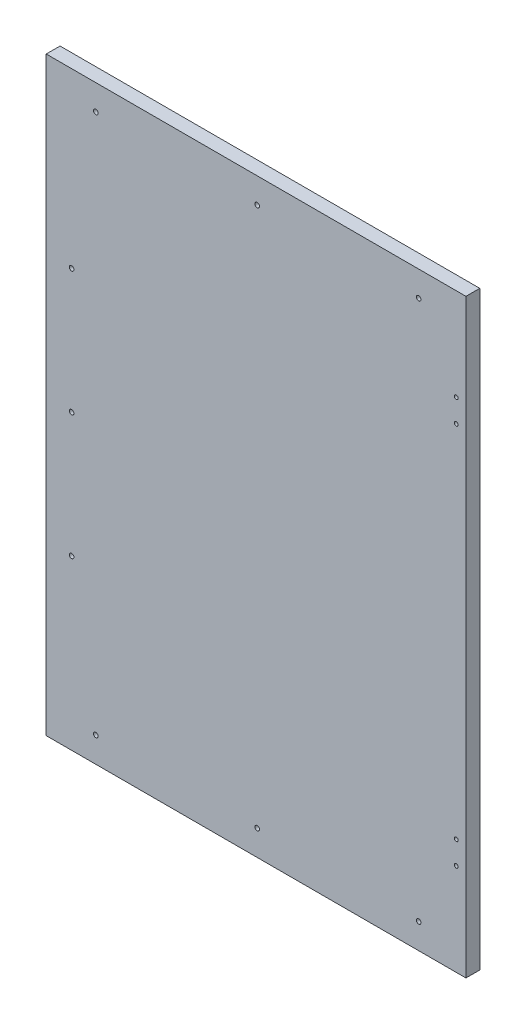
ISO-10303-21;
HEADER;
FILE_DESCRIPTION(('STEP AP214'),'2;1');
FILE_NAME('part.step','',(''),(''),'','','');
FILE_SCHEMA(('AUTOMOTIVE_DESIGN { 1 0 10303 214 1 1 1 1 }'));
ENDSEC;
DATA;
#1=APPLICATION_CONTEXT('core data for automotive mechanical design processes');
#2=APPLICATION_PROTOCOL_DEFINITION('international standard','automotive_design',2000,#1);
#3=PRODUCT_CONTEXT('',#1,'mechanical');
#4=PRODUCT('Part','Part','',(#3));
#5=PRODUCT_RELATED_PRODUCT_CATEGORY('part','',(#4));
#6=PRODUCT_DEFINITION_FORMATION('','',#4);
#7=PRODUCT_DEFINITION_CONTEXT('part definition',#1,'design');
#8=PRODUCT_DEFINITION('design','',#6,#7);
#9=PRODUCT_DEFINITION_SHAPE('','',#8);
#10=(LENGTH_UNIT() NAMED_UNIT(*) SI_UNIT(.MILLI.,.METRE.));
#11=(NAMED_UNIT(*) PLANE_ANGLE_UNIT() SI_UNIT($,.RADIAN.));
#12=(NAMED_UNIT(*) SI_UNIT($,.STERADIAN.) SOLID_ANGLE_UNIT());
#13=UNCERTAINTY_MEASURE_WITH_UNIT(LENGTH_MEASURE(1.E-05),#10,'distance_accuracy_value','');
#14=(GEOMETRIC_REPRESENTATION_CONTEXT(3) GLOBAL_UNCERTAINTY_ASSIGNED_CONTEXT((#13)) GLOBAL_UNIT_ASSIGNED_CONTEXT((#10,
#11,#12)) REPRESENTATION_CONTEXT('',''));
#15=CARTESIAN_POINT('',(0.,0.,0.));
#16=DIRECTION('',(0.,0.,1.));
#17=DIRECTION('',(1.,0.,0.));
#18=AXIS2_PLACEMENT_3D('',#15,#16,#17);
#19=CARTESIAN_POINT('',(227.5,320.,15.));
#20=DIRECTION('',(-1.,0.,0.));
#21=DIRECTION('',(0.,-1.,0.));
#22=AXIS2_PLACEMENT_3D('',#19,#20,#21);
#23=PLANE('',#22);
#24=DIRECTION('',(0.,1.,0.));
#25=VECTOR('',#24,1.);
#26=CARTESIAN_POINT('',(227.5,320.,0.));
#27=LINE('',#26,#25);
#28=CARTESIAN_POINT('',(227.5,-320.,0.));
#29=VERTEX_POINT('',#28);
#30=CARTESIAN_POINT('',(227.5,320.,0.));
#31=VERTEX_POINT('',#30);
#32=EDGE_CURVE('E100',#29,#31,#27,.T.);
#33=ORIENTED_EDGE('',*,*,#32,.T.);
#34=DIRECTION('',(0.,0.,-1.));
#35=VECTOR('',#34,1.);
#36=CARTESIAN_POINT('',(227.5,320.,15.));
#37=LINE('',#36,#35);
#38=CARTESIAN_POINT('',(227.5,320.,15.));
#39=VERTEX_POINT('',#38);
#40=EDGE_CURVE('E11',#39,#31,#37,.T.);
#41=ORIENTED_EDGE('',*,*,#40,.F.);
#42=DIRECTION('',(0.,1.,0.));
#43=VECTOR('',#42,1.);
#44=CARTESIAN_POINT('',(227.5,320.,15.));
#45=LINE('',#44,#43);
#46=CARTESIAN_POINT('',(227.5,-320.,15.));
#47=VERTEX_POINT('',#46);
#48=EDGE_CURVE('E88',#47,#39,#45,.T.);
#49=ORIENTED_EDGE('',*,*,#48,.F.);
#50=DIRECTION('',(0.,0.,-1.));
#51=VECTOR('',#50,1.);
#52=CARTESIAN_POINT('',(227.5,-320.,15.));
#53=LINE('',#52,#51);
#54=EDGE_CURVE('E96',#47,#29,#53,.T.);
#55=ORIENTED_EDGE('',*,*,#54,.T.);
#56=EDGE_LOOP('',(#33,#41,#49,#55));
#57=FACE_BOUND('',#56,.T.);
#58=ADVANCED_FACE('F37',(#57),#23,.F.);
#59=CARTESIAN_POINT('',(-227.5,320.,15.));
#60=DIRECTION('',(0.,-1.,0.));
#61=DIRECTION('',(0.,0.,-1.));
#62=AXIS2_PLACEMENT_3D('',#59,#60,#61);
#63=PLANE('',#62);
#64=DIRECTION('',(-1.,0.,0.));
#65=VECTOR('',#64,1.);
#66=CARTESIAN_POINT('',(-227.5,320.,0.));
#67=LINE('',#66,#65);
#68=CARTESIAN_POINT('',(-227.5,320.,0.));
#69=VERTEX_POINT('',#68);
#70=EDGE_CURVE('E92',#31,#69,#67,.T.);
#71=ORIENTED_EDGE('',*,*,#70,.T.);
#72=DIRECTION('',(0.,0.,-1.));
#73=VECTOR('',#72,1.);
#74=CARTESIAN_POINT('',(-227.5,320.,15.));
#75=LINE('',#74,#73);
#76=CARTESIAN_POINT('',(-227.5,320.,15.));
#77=VERTEX_POINT('',#76);
#78=EDGE_CURVE('E45',#77,#69,#75,.T.);
#79=ORIENTED_EDGE('',*,*,#78,.F.);
#80=DIRECTION('',(-1.,0.,0.));
#81=VECTOR('',#80,1.);
#82=CARTESIAN_POINT('',(-227.5,320.,15.));
#83=LINE('',#82,#81);
#84=EDGE_CURVE('E83',#39,#77,#83,.T.);
#85=ORIENTED_EDGE('',*,*,#84,.F.);
#86=ORIENTED_EDGE('',*,*,#40,.T.);
#87=EDGE_LOOP('',(#71,#79,#85,#86));
#88=FACE_BOUND('',#87,.T.);
#89=ADVANCED_FACE('F91',(#88),#63,.F.);
#90=CARTESIAN_POINT('',(-227.5,320.,15.));
#91=DIRECTION('',(1.,0.,0.));
#92=DIRECTION('',(0.,1.,0.));
#93=AXIS2_PLACEMENT_3D('',#90,#91,#92);
#94=PLANE('',#93);
#95=DIRECTION('',(0.,-1.,0.));
#96=VECTOR('',#95,1.);
#97=CARTESIAN_POINT('',(-227.5,320.,0.));
#98=LINE('',#97,#96);
#99=CARTESIAN_POINT('',(-227.5,-320.,0.));
#100=VERTEX_POINT('',#99);
#101=EDGE_CURVE('E70',#69,#100,#98,.T.);
#102=ORIENTED_EDGE('',*,*,#101,.T.);
#103=DIRECTION('',(0.,0.,-1.));
#104=VECTOR('',#103,1.);
#105=CARTESIAN_POINT('',(-227.5,-320.,15.));
#106=LINE('',#105,#104);
#107=CARTESIAN_POINT('',(-227.5,-320.,15.));
#108=VERTEX_POINT('',#107);
#109=EDGE_CURVE('E93',#108,#100,#106,.T.);
#110=ORIENTED_EDGE('',*,*,#109,.F.);
#111=DIRECTION('',(0.,-1.,0.));
#112=VECTOR('',#111,1.);
#113=CARTESIAN_POINT('',(-227.5,320.,15.));
#114=LINE('',#113,#112);
#115=EDGE_CURVE('E86',#77,#108,#114,.T.);
#116=ORIENTED_EDGE('',*,*,#115,.F.);
#117=ORIENTED_EDGE('',*,*,#78,.T.);
#118=EDGE_LOOP('',(#102,#110,#116,#117));
#119=FACE_BOUND('',#118,.T.);
#120=ADVANCED_FACE('F94',(#119),#94,.F.);
#121=CARTESIAN_POINT('',(-227.5,-320.,15.));
#122=DIRECTION('',(0.,1.,0.));
#123=DIRECTION('',(0.,0.,1.));
#124=AXIS2_PLACEMENT_3D('',#121,#122,#123);
#125=PLANE('',#124);
#126=DIRECTION('',(1.,0.,0.));
#127=VECTOR('',#126,1.);
#128=CARTESIAN_POINT('',(-227.5,-320.,0.));
#129=LINE('',#128,#127);
#130=EDGE_CURVE('E76',#100,#29,#129,.T.);
#131=ORIENTED_EDGE('',*,*,#130,.T.);
#132=ORIENTED_EDGE('',*,*,#54,.F.);
#133=DIRECTION('',(1.,0.,0.));
#134=VECTOR('',#133,1.);
#135=CARTESIAN_POINT('',(-227.5,-320.,15.));
#136=LINE('',#135,#134);
#137=EDGE_CURVE('E53',#108,#47,#136,.T.);
#138=ORIENTED_EDGE('',*,*,#137,.F.);
#139=ORIENTED_EDGE('',*,*,#109,.T.);
#140=EDGE_LOOP('',(#131,#132,#138,#139));
#141=FACE_BOUND('',#140,.T.);
#142=ADVANCED_FACE('F108',(#141),#125,.F.);
#143=CARTESIAN_POINT('',(0.,0.,15.));
#144=DIRECTION('',(0.,0.,1.));
#145=DIRECTION('',(1.,0.,0.));
#146=AXIS2_PLACEMENT_3D('',#143,#144,#145);
#147=PLANE('',#146);
#148=CARTESIAN_POINT('',(217.,220.,15.));
#149=DIRECTION('',(0.,0.,-1.));
#150=DIRECTION('',(1.,0.,0.));
#151=AXIS2_PLACEMENT_3D('',#148,#149,#150);
#152=CIRCLE('',#151,2.09999999999999);
#153=CARTESIAN_POINT('',(219.1,220.,15.));
#154=VERTEX_POINT('',#153);
#155=EDGE_CURVE('E186',#154,#154,#152,.T.);
#156=ORIENTED_EDGE('',*,*,#155,.T.);
#157=EDGE_LOOP('',(#156));
#158=FACE_BOUND('',#157,.T.);
#159=CARTESIAN_POINT('',(217.,195.,15.));
#160=DIRECTION('',(0.,0.,-1.));
#161=DIRECTION('',(1.,0.,0.));
#162=AXIS2_PLACEMENT_3D('',#159,#160,#161);
#163=CIRCLE('',#162,2.09999999999999);
#164=CARTESIAN_POINT('',(219.1,195.,15.));
#165=VERTEX_POINT('',#164);
#166=EDGE_CURVE('E180',#165,#165,#163,.T.);
#167=ORIENTED_EDGE('',*,*,#166,.T.);
#168=EDGE_LOOP('',(#167));
#169=FACE_BOUND('',#168,.T.);
#170=CARTESIAN_POINT('',(217.,-220.,15.));
#171=DIRECTION('',(0.,0.,1.));
#172=DIRECTION('',(1.,0.,0.));
#173=AXIS2_PLACEMENT_3D('',#170,#171,#172);
#174=CIRCLE('',#173,2.09999999999999);
#175=CARTESIAN_POINT('',(219.1,-220.,15.));
#176=VERTEX_POINT('',#175);
#177=EDGE_CURVE('E175',#176,#176,#174,.T.);
#178=ORIENTED_EDGE('',*,*,#177,.F.);
#179=EDGE_LOOP('',(#178));
#180=FACE_BOUND('',#179,.T.);
#181=CARTESIAN_POINT('',(217.,-195.,15.));
#182=DIRECTION('',(0.,0.,1.));
#183=DIRECTION('',(1.,0.,0.));
#184=AXIS2_PLACEMENT_3D('',#181,#182,#183);
#185=CIRCLE('',#184,2.09999999999999);
#186=CARTESIAN_POINT('',(219.1,-195.,15.));
#187=VERTEX_POINT('',#186);
#188=EDGE_CURVE('E171',#187,#187,#185,.T.);
#189=ORIENTED_EDGE('',*,*,#188,.F.);
#190=EDGE_LOOP('',(#189));
#191=FACE_BOUND('',#190,.T.);
#192=CARTESIAN_POINT('',(-173.75,-292.5,15.));
#193=DIRECTION('',(0.,0.,-1.));
#194=DIRECTION('',(1.,0.,0.));
#195=AXIS2_PLACEMENT_3D('',#192,#193,#194);
#196=CIRCLE('',#195,2.50000000000002);
#197=CARTESIAN_POINT('',(-171.25,-292.5,15.));
#198=VERTEX_POINT('',#197);
#199=EDGE_CURVE('E163',#198,#198,#196,.T.);
#200=ORIENTED_EDGE('',*,*,#199,.T.);
#201=EDGE_LOOP('',(#200));
#202=FACE_BOUND('',#201,.T.);
#203=CARTESIAN_POINT('',(1.24999999999997,-292.5,15.));
#204=DIRECTION('',(0.,0.,-1.));
#205=DIRECTION('',(1.,0.,0.));
#206=AXIS2_PLACEMENT_3D('',#203,#204,#205);
#207=CIRCLE('',#206,2.5);
#208=CARTESIAN_POINT('',(3.74999999999998,-292.5,15.));
#209=VERTEX_POINT('',#208);
#210=EDGE_CURVE('E157',#209,#209,#207,.T.);
#211=ORIENTED_EDGE('',*,*,#210,.T.);
#212=EDGE_LOOP('',(#211));
#213=FACE_BOUND('',#212,.T.);
#214=CARTESIAN_POINT('',(176.25,-292.5,15.));
#215=DIRECTION('',(0.,0.,-1.));
#216=DIRECTION('',(1.,0.,0.));
#217=AXIS2_PLACEMENT_3D('',#214,#215,#216);
#218=CIRCLE('',#217,2.50000000000002);
#219=CARTESIAN_POINT('',(178.75,-292.5,15.));
#220=VERTEX_POINT('',#219);
#221=EDGE_CURVE('E150',#220,#220,#218,.T.);
#222=ORIENTED_EDGE('',*,*,#221,.T.);
#223=EDGE_LOOP('',(#222));
#224=FACE_BOUND('',#223,.T.);
#225=CARTESIAN_POINT('',(-173.75,292.5,15.));
#226=DIRECTION('',(0.,0.,1.));
#227=DIRECTION('',(1.,0.,0.));
#228=AXIS2_PLACEMENT_3D('',#225,#226,#227);
#229=CIRCLE('',#228,2.50000000000002);
#230=CARTESIAN_POINT('',(-171.25,292.5,15.));
#231=VERTEX_POINT('',#230);
#232=EDGE_CURVE('E145',#231,#231,#229,.T.);
#233=ORIENTED_EDGE('',*,*,#232,.F.);
#234=EDGE_LOOP('',(#233));
#235=FACE_BOUND('',#234,.T.);
#236=CARTESIAN_POINT('',(1.24999999999997,292.5,15.));
#237=DIRECTION('',(0.,0.,1.));
#238=DIRECTION('',(1.,0.,0.));
#239=AXIS2_PLACEMENT_3D('',#236,#237,#238);
#240=CIRCLE('',#239,2.5);
#241=CARTESIAN_POINT('',(3.74999999999998,292.5,15.));
#242=VERTEX_POINT('',#241);
#243=EDGE_CURVE('E142',#242,#242,#240,.T.);
#244=ORIENTED_EDGE('',*,*,#243,.F.);
#245=EDGE_LOOP('',(#244));
#246=FACE_BOUND('',#245,.T.);
#247=CARTESIAN_POINT('',(176.25,292.5,15.));
#248=DIRECTION('',(0.,0.,1.));
#249=DIRECTION('',(1.,0.,0.));
#250=AXIS2_PLACEMENT_3D('',#247,#248,#249);
#251=CIRCLE('',#250,2.50000000000002);
#252=CARTESIAN_POINT('',(178.75,292.5,15.));
#253=VERTEX_POINT('',#252);
#254=EDGE_CURVE('E135',#253,#253,#251,.T.);
#255=ORIENTED_EDGE('',*,*,#254,.F.);
#256=EDGE_LOOP('',(#255));
#257=FACE_BOUND('',#256,.T.);
#258=CARTESIAN_POINT('',(-200.,-137.5,15.));
#259=DIRECTION('',(0.,0.,1.));
#260=DIRECTION('',(1.,0.,0.));
#261=AXIS2_PLACEMENT_3D('',#258,#259,#260);
#262=CIRCLE('',#261,2.50000000000002);
#263=CARTESIAN_POINT('',(-197.5,-137.5,15.));
#264=VERTEX_POINT('',#263);
#265=EDGE_CURVE('E103',#264,#264,#262,.T.);
#266=ORIENTED_EDGE('',*,*,#265,.F.);
#267=EDGE_LOOP('',(#266));
#268=FACE_BOUND('',#267,.T.);
#269=CARTESIAN_POINT('',(-200.,-2.49999999999995,15.));
#270=DIRECTION('',(0.,0.,1.));
#271=DIRECTION('',(1.,0.,0.));
#272=AXIS2_PLACEMENT_3D('',#269,#270,#271);
#273=CIRCLE('',#272,2.50000000000002);
#274=CARTESIAN_POINT('',(-197.5,-2.49999999999995,15.));
#275=VERTEX_POINT('',#274);
#276=EDGE_CURVE('E116',#275,#275,#273,.T.);
#277=ORIENTED_EDGE('',*,*,#276,.F.);
#278=EDGE_LOOP('',(#277));
#279=FACE_BOUND('',#278,.T.);
#280=CARTESIAN_POINT('',(-200.,132.5,15.));
#281=DIRECTION('',(0.,0.,1.));
#282=DIRECTION('',(1.,0.,0.));
#283=AXIS2_PLACEMENT_3D('',#280,#281,#282);
#284=CIRCLE('',#283,2.50000000000002);
#285=CARTESIAN_POINT('',(-197.5,132.5,15.));
#286=VERTEX_POINT('',#285);
#287=EDGE_CURVE('E119',#286,#286,#284,.T.);
#288=ORIENTED_EDGE('',*,*,#287,.F.);
#289=EDGE_LOOP('',(#288));
#290=FACE_BOUND('',#289,.T.);
#291=ORIENTED_EDGE('',*,*,#48,.T.);
#292=ORIENTED_EDGE('',*,*,#84,.T.);
#293=ORIENTED_EDGE('',*,*,#115,.T.);
#294=ORIENTED_EDGE('',*,*,#137,.T.);
#295=EDGE_LOOP('',(#291,#292,#293,#294));
#296=FACE_BOUND('',#295,.T.);
#297=ADVANCED_FACE('F84',(#158,#169,#180,#191,#202,#213,#224,#235,#246,#257,#268,#279,#290,
#296),#147,.T.);
#298=CARTESIAN_POINT('',(0.,0.,0.));
#299=DIRECTION('',(0.,0.,1.));
#300=DIRECTION('',(1.,0.,0.));
#301=AXIS2_PLACEMENT_3D('',#298,#299,#300);
#302=PLANE('',#301);
#303=CARTESIAN_POINT('',(217.,220.,0.));
#304=DIRECTION('',(0.,0.,-1.));
#305=DIRECTION('',(1.,0.,0.));
#306=AXIS2_PLACEMENT_3D('',#303,#304,#305);
#307=CIRCLE('',#306,2.09999999999999);
#308=CARTESIAN_POINT('',(219.1,220.,0.));
#309=VERTEX_POINT('',#308);
#310=EDGE_CURVE('E172',#309,#309,#307,.T.);
#311=ORIENTED_EDGE('',*,*,#310,.F.);
#312=EDGE_LOOP('',(#311));
#313=FACE_BOUND('',#312,.T.);
#314=CARTESIAN_POINT('',(217.,195.,0.));
#315=DIRECTION('',(0.,0.,-1.));
#316=DIRECTION('',(1.,0.,0.));
#317=AXIS2_PLACEMENT_3D('',#314,#315,#316);
#318=CIRCLE('',#317,2.09999999999999);
#319=CARTESIAN_POINT('',(219.1,195.,0.));
#320=VERTEX_POINT('',#319);
#321=EDGE_CURVE('E183',#320,#320,#318,.T.);
#322=ORIENTED_EDGE('',*,*,#321,.F.);
#323=EDGE_LOOP('',(#322));
#324=FACE_BOUND('',#323,.T.);
#325=CARTESIAN_POINT('',(217.,-220.,0.));
#326=DIRECTION('',(0.,0.,1.));
#327=DIRECTION('',(1.,0.,0.));
#328=AXIS2_PLACEMENT_3D('',#325,#326,#327);
#329=CIRCLE('',#328,2.09999999999999);
#330=CARTESIAN_POINT('',(219.1,-220.,0.));
#331=VERTEX_POINT('',#330);
#332=EDGE_CURVE('E154',#331,#331,#329,.T.);
#333=ORIENTED_EDGE('',*,*,#332,.T.);
#334=EDGE_LOOP('',(#333));
#335=FACE_BOUND('',#334,.T.);
#336=CARTESIAN_POINT('',(217.,-195.,0.));
#337=DIRECTION('',(0.,0.,1.));
#338=DIRECTION('',(1.,0.,0.));
#339=AXIS2_PLACEMENT_3D('',#336,#337,#338);
#340=CIRCLE('',#339,2.09999999999999);
#341=CARTESIAN_POINT('',(219.1,-195.,0.));
#342=VERTEX_POINT('',#341);
#343=EDGE_CURVE('E168',#342,#342,#340,.T.);
#344=ORIENTED_EDGE('',*,*,#343,.T.);
#345=EDGE_LOOP('',(#344));
#346=FACE_BOUND('',#345,.T.);
#347=CARTESIAN_POINT('',(-173.75,-292.5,0.));
#348=DIRECTION('',(0.,0.,-1.));
#349=DIRECTION('',(1.,0.,0.));
#350=AXIS2_PLACEMENT_3D('',#347,#348,#349);
#351=CIRCLE('',#350,2.50000000000002);
#352=CARTESIAN_POINT('',(-171.25,-292.5,0.));
#353=VERTEX_POINT('',#352);
#354=EDGE_CURVE('E136',#353,#353,#351,.T.);
#355=ORIENTED_EDGE('',*,*,#354,.F.);
#356=EDGE_LOOP('',(#355));
#357=FACE_BOUND('',#356,.T.);
#358=CARTESIAN_POINT('',(1.24999999999997,-292.5,0.));
#359=DIRECTION('',(0.,0.,-1.));
#360=DIRECTION('',(1.,0.,0.));
#361=AXIS2_PLACEMENT_3D('',#358,#359,#360);
#362=CIRCLE('',#361,2.5);
#363=CARTESIAN_POINT('',(3.74999999999998,-292.5,0.));
#364=VERTEX_POINT('',#363);
#365=EDGE_CURVE('E160',#364,#364,#362,.T.);
#366=ORIENTED_EDGE('',*,*,#365,.F.);
#367=EDGE_LOOP('',(#366));
#368=FACE_BOUND('',#367,.T.);
#369=CARTESIAN_POINT('',(176.25,-292.5,0.));
#370=DIRECTION('',(0.,0.,-1.));
#371=DIRECTION('',(1.,0.,0.));
#372=AXIS2_PLACEMENT_3D('',#369,#370,#371);
#373=CIRCLE('',#372,2.50000000000002);
#374=CARTESIAN_POINT('',(178.75,-292.5,0.));
#375=VERTEX_POINT('',#374);
#376=EDGE_CURVE('E153',#375,#375,#373,.T.);
#377=ORIENTED_EDGE('',*,*,#376,.F.);
#378=EDGE_LOOP('',(#377));
#379=FACE_BOUND('',#378,.T.);
#380=CARTESIAN_POINT('',(-173.75,292.5,0.));
#381=DIRECTION('',(0.,0.,1.));
#382=DIRECTION('',(1.,0.,0.));
#383=AXIS2_PLACEMENT_3D('',#380,#381,#382);
#384=CIRCLE('',#383,2.50000000000002);
#385=CARTESIAN_POINT('',(-171.25,292.5,0.));
#386=VERTEX_POINT('',#385);
#387=EDGE_CURVE('E127',#386,#386,#384,.T.);
#388=ORIENTED_EDGE('',*,*,#387,.T.);
#389=EDGE_LOOP('',(#388));
#390=FACE_BOUND('',#389,.T.);
#391=CARTESIAN_POINT('',(1.24999999999997,292.5,0.));
#392=DIRECTION('',(0.,0.,1.));
#393=DIRECTION('',(1.,0.,0.));
#394=AXIS2_PLACEMENT_3D('',#391,#392,#393);
#395=CIRCLE('',#394,2.5);
#396=CARTESIAN_POINT('',(3.74999999999998,292.5,0.));
#397=VERTEX_POINT('',#396);
#398=EDGE_CURVE('E139',#397,#397,#395,.T.);
#399=ORIENTED_EDGE('',*,*,#398,.T.);
#400=EDGE_LOOP('',(#399));
#401=FACE_BOUND('',#400,.T.);
#402=CARTESIAN_POINT('',(176.25,292.5,0.));
#403=DIRECTION('',(0.,0.,1.));
#404=DIRECTION('',(1.,0.,0.));
#405=AXIS2_PLACEMENT_3D('',#402,#403,#404);
#406=CIRCLE('',#405,2.50000000000002);
#407=CARTESIAN_POINT('',(178.75,292.5,0.));
#408=VERTEX_POINT('',#407);
#409=EDGE_CURVE('E132',#408,#408,#406,.T.);
#410=ORIENTED_EDGE('',*,*,#409,.T.);
#411=EDGE_LOOP('',(#410));
#412=FACE_BOUND('',#411,.T.);
#413=CARTESIAN_POINT('',(-200.,-137.5,0.));
#414=DIRECTION('',(0.,0.,1.));
#415=DIRECTION('',(1.,0.,0.));
#416=AXIS2_PLACEMENT_3D('',#413,#414,#415);
#417=CIRCLE('',#416,2.50000000000002);
#418=CARTESIAN_POINT('',(-197.5,-137.5,0.));
#419=VERTEX_POINT('',#418);
#420=EDGE_CURVE('E122',#419,#419,#417,.T.);
#421=ORIENTED_EDGE('',*,*,#420,.T.);
#422=EDGE_LOOP('',(#421));
#423=FACE_BOUND('',#422,.T.);
#424=CARTESIAN_POINT('',(-200.,-2.49999999999995,0.));
#425=DIRECTION('',(0.,0.,1.));
#426=DIRECTION('',(1.,0.,0.));
#427=AXIS2_PLACEMENT_3D('',#424,#425,#426);
#428=CIRCLE('',#427,2.50000000000002);
#429=CARTESIAN_POINT('',(-197.5,-2.49999999999995,0.));
#430=VERTEX_POINT('',#429);
#431=EDGE_CURVE('E126',#430,#430,#428,.T.);
#432=ORIENTED_EDGE('',*,*,#431,.T.);
#433=EDGE_LOOP('',(#432));
#434=FACE_BOUND('',#433,.T.);
#435=CARTESIAN_POINT('',(-200.,132.5,0.));
#436=DIRECTION('',(0.,0.,1.));
#437=DIRECTION('',(1.,0.,0.));
#438=AXIS2_PLACEMENT_3D('',#435,#436,#437);
#439=CIRCLE('',#438,2.50000000000002);
#440=CARTESIAN_POINT('',(-197.5,132.5,0.));
#441=VERTEX_POINT('',#440);
#442=EDGE_CURVE('E123',#441,#441,#439,.T.);
#443=ORIENTED_EDGE('',*,*,#442,.T.);
#444=EDGE_LOOP('',(#443));
#445=FACE_BOUND('',#444,.T.);
#446=ORIENTED_EDGE('',*,*,#32,.F.);
#447=ORIENTED_EDGE('',*,*,#130,.F.);
#448=ORIENTED_EDGE('',*,*,#101,.F.);
#449=ORIENTED_EDGE('',*,*,#70,.F.);
#450=EDGE_LOOP('',(#446,#447,#448,#449));
#451=FACE_BOUND('',#450,.T.);
#452=ADVANCED_FACE('F111',(#313,#324,#335,#346,#357,#368,#379,#390,#401,#412,#423,#434,#445,
#451),#302,.F.);
#453=CARTESIAN_POINT('',(-200.,132.5,0.));
#454=DIRECTION('',(0.,0.,1.));
#455=DIRECTION('',(1.,0.,0.));
#456=AXIS2_PLACEMENT_3D('',#453,#454,#455);
#457=CYLINDRICAL_SURFACE('',#456,2.50000000000002);
#458=ORIENTED_EDGE('',*,*,#287,.T.);
#459=EDGE_LOOP('',(#458));
#460=FACE_BOUND('',#459,.T.);
#461=ORIENTED_EDGE('',*,*,#442,.F.);
#462=EDGE_LOOP('',(#461));
#463=FACE_BOUND('',#462,.T.);
#464=ADVANCED_FACE('F197',(#460,#463),#457,.F.);
#465=CARTESIAN_POINT('',(-200.,-2.49999999999995,0.));
#466=DIRECTION('',(0.,0.,1.));
#467=DIRECTION('',(1.,0.,0.));
#468=AXIS2_PLACEMENT_3D('',#465,#466,#467);
#469=CYLINDRICAL_SURFACE('',#468,2.50000000000002);
#470=ORIENTED_EDGE('',*,*,#276,.T.);
#471=EDGE_LOOP('',(#470));
#472=FACE_BOUND('',#471,.T.);
#473=ORIENTED_EDGE('',*,*,#431,.F.);
#474=EDGE_LOOP('',(#473));
#475=FACE_BOUND('',#474,.T.);
#476=ADVANCED_FACE('F224',(#472,#475),#469,.F.);
#477=CARTESIAN_POINT('',(-200.,-137.5,0.));
#478=DIRECTION('',(0.,0.,1.));
#479=DIRECTION('',(1.,0.,0.));
#480=AXIS2_PLACEMENT_3D('',#477,#478,#479);
#481=CYLINDRICAL_SURFACE('',#480,2.50000000000002);
#482=ORIENTED_EDGE('',*,*,#265,.T.);
#483=EDGE_LOOP('',(#482));
#484=FACE_BOUND('',#483,.T.);
#485=ORIENTED_EDGE('',*,*,#420,.F.);
#486=EDGE_LOOP('',(#485));
#487=FACE_BOUND('',#486,.T.);
#488=ADVANCED_FACE('F230',(#484,#487),#481,.F.);
#489=CARTESIAN_POINT('',(176.25,292.5,0.));
#490=DIRECTION('',(0.,0.,1.));
#491=DIRECTION('',(1.,0.,0.));
#492=AXIS2_PLACEMENT_3D('',#489,#490,#491);
#493=CYLINDRICAL_SURFACE('',#492,2.50000000000002);
#494=ORIENTED_EDGE('',*,*,#409,.F.);
#495=EDGE_LOOP('',(#494));
#496=FACE_BOUND('',#495,.T.);
#497=ORIENTED_EDGE('',*,*,#254,.T.);
#498=EDGE_LOOP('',(#497));
#499=FACE_BOUND('',#498,.T.);
#500=ADVANCED_FACE('F277',(#496,#499),#493,.F.);
#501=CARTESIAN_POINT('',(1.24999999999997,292.5,0.));
#502=DIRECTION('',(0.,0.,1.));
#503=DIRECTION('',(1.,0.,0.));
#504=AXIS2_PLACEMENT_3D('',#501,#502,#503);
#505=CYLINDRICAL_SURFACE('',#504,2.5);
#506=ORIENTED_EDGE('',*,*,#398,.F.);
#507=EDGE_LOOP('',(#506));
#508=FACE_BOUND('',#507,.T.);
#509=ORIENTED_EDGE('',*,*,#243,.T.);
#510=EDGE_LOOP('',(#509));
#511=FACE_BOUND('',#510,.T.);
#512=ADVANCED_FACE('F282',(#508,#511),#505,.F.);
#513=CARTESIAN_POINT('',(-173.75,292.5,0.));
#514=DIRECTION('',(0.,0.,1.));
#515=DIRECTION('',(1.,0.,0.));
#516=AXIS2_PLACEMENT_3D('',#513,#514,#515);
#517=CYLINDRICAL_SURFACE('',#516,2.50000000000002);
#518=ORIENTED_EDGE('',*,*,#387,.F.);
#519=EDGE_LOOP('',(#518));
#520=FACE_BOUND('',#519,.T.);
#521=ORIENTED_EDGE('',*,*,#232,.T.);
#522=EDGE_LOOP('',(#521));
#523=FACE_BOUND('',#522,.T.);
#524=ADVANCED_FACE('F288',(#520,#523),#517,.F.);
#525=CARTESIAN_POINT('',(176.25,-292.5,0.));
#526=DIRECTION('',(0.,0.,1.));
#527=DIRECTION('',(1.,0.,0.));
#528=AXIS2_PLACEMENT_3D('',#525,#526,#527);
#529=CYLINDRICAL_SURFACE('',#528,2.50000000000002);
#530=ORIENTED_EDGE('',*,*,#376,.T.);
#531=EDGE_LOOP('',(#530));
#532=FACE_BOUND('',#531,.T.);
#533=ORIENTED_EDGE('',*,*,#221,.F.);
#534=EDGE_LOOP('',(#533));
#535=FACE_BOUND('',#534,.T.);
#536=ADVANCED_FACE('F292',(#532,#535),#529,.F.);
#537=CARTESIAN_POINT('',(1.24999999999997,-292.5,0.));
#538=DIRECTION('',(0.,0.,1.));
#539=DIRECTION('',(1.,0.,0.));
#540=AXIS2_PLACEMENT_3D('',#537,#538,#539);
#541=CYLINDRICAL_SURFACE('',#540,2.5);
#542=ORIENTED_EDGE('',*,*,#365,.T.);
#543=EDGE_LOOP('',(#542));
#544=FACE_BOUND('',#543,.T.);
#545=ORIENTED_EDGE('',*,*,#210,.F.);
#546=EDGE_LOOP('',(#545));
#547=FACE_BOUND('',#546,.T.);
#548=ADVANCED_FACE('F296',(#544,#547),#541,.F.);
#549=CARTESIAN_POINT('',(-173.75,-292.5,0.));
#550=DIRECTION('',(0.,0.,1.));
#551=DIRECTION('',(1.,0.,0.));
#552=AXIS2_PLACEMENT_3D('',#549,#550,#551);
#553=CYLINDRICAL_SURFACE('',#552,2.50000000000002);
#554=ORIENTED_EDGE('',*,*,#354,.T.);
#555=EDGE_LOOP('',(#554));
#556=FACE_BOUND('',#555,.T.);
#557=ORIENTED_EDGE('',*,*,#199,.F.);
#558=EDGE_LOOP('',(#557));
#559=FACE_BOUND('',#558,.T.);
#560=ADVANCED_FACE('F300',(#556,#559),#553,.F.);
#561=CARTESIAN_POINT('',(217.,-195.,0.));
#562=DIRECTION('',(0.,0.,1.));
#563=DIRECTION('',(1.,0.,0.));
#564=AXIS2_PLACEMENT_3D('',#561,#562,#563);
#565=CYLINDRICAL_SURFACE('',#564,2.09999999999999);
#566=ORIENTED_EDGE('',*,*,#343,.F.);
#567=EDGE_LOOP('',(#566));
#568=FACE_BOUND('',#567,.T.);
#569=ORIENTED_EDGE('',*,*,#188,.T.);
#570=EDGE_LOOP('',(#569));
#571=FACE_BOUND('',#570,.T.);
#572=ADVANCED_FACE('F304',(#568,#571),#565,.F.);
#573=CARTESIAN_POINT('',(217.,-220.,0.));
#574=DIRECTION('',(0.,0.,1.));
#575=DIRECTION('',(1.,0.,0.));
#576=AXIS2_PLACEMENT_3D('',#573,#574,#575);
#577=CYLINDRICAL_SURFACE('',#576,2.09999999999999);
#578=ORIENTED_EDGE('',*,*,#332,.F.);
#579=EDGE_LOOP('',(#578));
#580=FACE_BOUND('',#579,.T.);
#581=ORIENTED_EDGE('',*,*,#177,.T.);
#582=EDGE_LOOP('',(#581));
#583=FACE_BOUND('',#582,.T.);
#584=ADVANCED_FACE('F308',(#580,#583),#577,.F.);
#585=CARTESIAN_POINT('',(217.,195.,0.));
#586=DIRECTION('',(0.,0.,1.));
#587=DIRECTION('',(1.,0.,0.));
#588=AXIS2_PLACEMENT_3D('',#585,#586,#587);
#589=CYLINDRICAL_SURFACE('',#588,2.09999999999999);
#590=ORIENTED_EDGE('',*,*,#321,.T.);
#591=EDGE_LOOP('',(#590));
#592=FACE_BOUND('',#591,.T.);
#593=ORIENTED_EDGE('',*,*,#166,.F.);
#594=EDGE_LOOP('',(#593));
#595=FACE_BOUND('',#594,.T.);
#596=ADVANCED_FACE('F312',(#592,#595),#589,.F.);
#597=CARTESIAN_POINT('',(217.,220.,0.));
#598=DIRECTION('',(0.,0.,1.));
#599=DIRECTION('',(1.,0.,0.));
#600=AXIS2_PLACEMENT_3D('',#597,#598,#599);
#601=CYLINDRICAL_SURFACE('',#600,2.09999999999999);
#602=ORIENTED_EDGE('',*,*,#310,.T.);
#603=EDGE_LOOP('',(#602));
#604=FACE_BOUND('',#603,.T.);
#605=ORIENTED_EDGE('',*,*,#155,.F.);
#606=EDGE_LOOP('',(#605));
#607=FACE_BOUND('',#606,.T.);
#608=ADVANCED_FACE('F192',(#604,#607),#601,.F.);
#609=CLOSED_SHELL('',(#58,#89,#120,#142,#297,#452,#464,#476,#488,#500,#512,#524,#536,#548,#560,
#572,#584,#596,#608));
#610=MANIFOLD_SOLID_BREP('B2',#609);
#611=ADVANCED_BREP_SHAPE_REPRESENTATION('',(#18,#610),#14);
#612=SHAPE_DEFINITION_REPRESENTATION(#9,#611);
ENDSEC;
END-ISO-10303-21;
